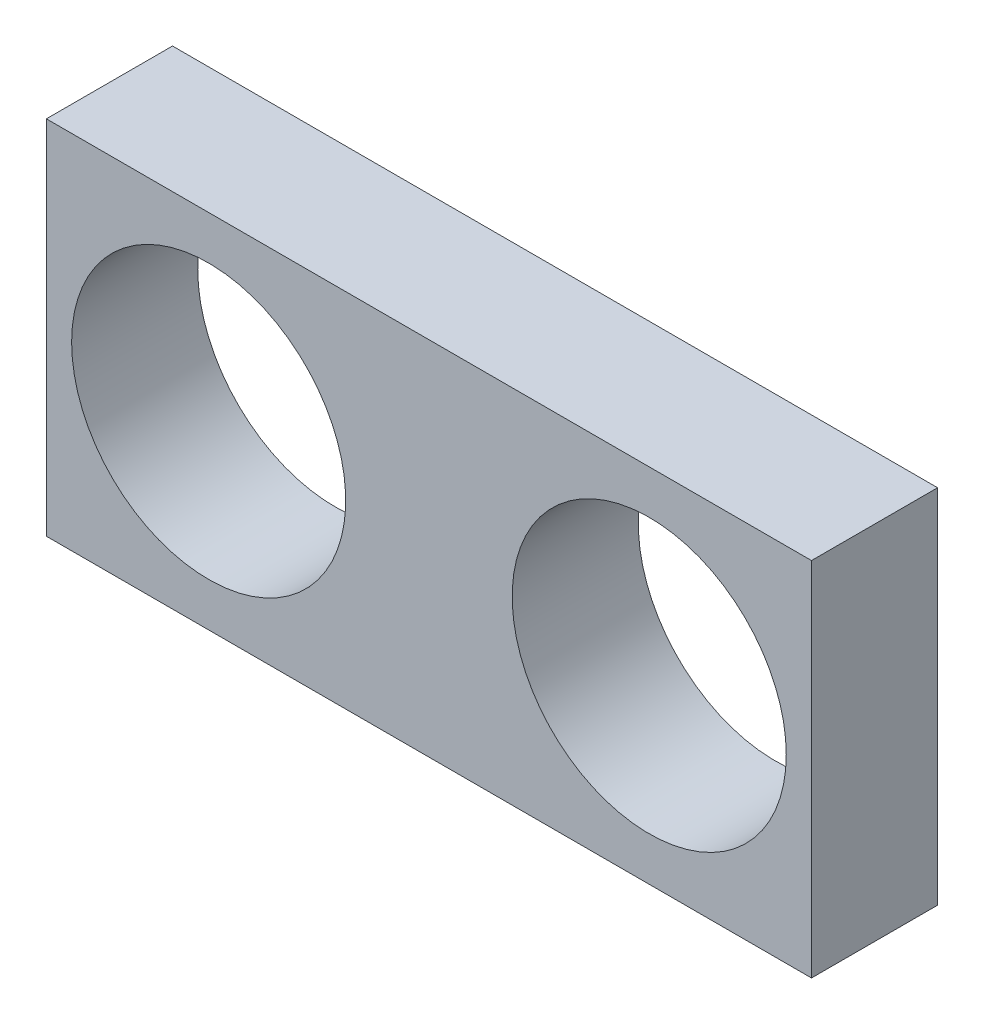
ISO-10303-21;
HEADER;
FILE_DESCRIPTION(('STEP AP214'),'2;1');
FILE_NAME('part.step','',(''),(''),'','','');
FILE_SCHEMA(('AUTOMOTIVE_DESIGN { 1 0 10303 214 1 1 1 1 }'));
ENDSEC;
DATA;
#1=APPLICATION_CONTEXT('core data for automotive mechanical design processes');
#2=APPLICATION_PROTOCOL_DEFINITION('international standard','automotive_design',2000,#1);
#3=PRODUCT_CONTEXT('',#1,'mechanical');
#4=PRODUCT('Part','Part','',(#3));
#5=PRODUCT_RELATED_PRODUCT_CATEGORY('part','',(#4));
#6=PRODUCT_DEFINITION_FORMATION('','',#4);
#7=PRODUCT_DEFINITION_CONTEXT('part definition',#1,'design');
#8=PRODUCT_DEFINITION('design','',#6,#7);
#9=PRODUCT_DEFINITION_SHAPE('','',#8);
#10=(LENGTH_UNIT() NAMED_UNIT(*) SI_UNIT(.MILLI.,.METRE.));
#11=(NAMED_UNIT(*) PLANE_ANGLE_UNIT() SI_UNIT($,.RADIAN.));
#12=(NAMED_UNIT(*) SI_UNIT($,.STERADIAN.) SOLID_ANGLE_UNIT());
#13=UNCERTAINTY_MEASURE_WITH_UNIT(LENGTH_MEASURE(1.E-05),#10,'distance_accuracy_value','');
#14=(GEOMETRIC_REPRESENTATION_CONTEXT(3) GLOBAL_UNCERTAINTY_ASSIGNED_CONTEXT((#13)) GLOBAL_UNIT_ASSIGNED_CONTEXT((#10,
#11,#12)) REPRESENTATION_CONTEXT('',''));
#15=CARTESIAN_POINT('',(0.,0.,0.));
#16=DIRECTION('',(0.,0.,1.));
#17=DIRECTION('',(1.,0.,0.));
#18=AXIS2_PLACEMENT_3D('',#15,#16,#17);
#19=CARTESIAN_POINT('',(0.,0.,7.5));
#20=DIRECTION('',(0.,0.,1.));
#21=DIRECTION('',(1.,0.,0.));
#22=AXIS2_PLACEMENT_3D('',#19,#20,#21);
#23=PLANE('',#22);
#24=CARTESIAN_POINT('',(12.6218914185639,9.88835376532399,7.5));
#25=DIRECTION('',(0.,0.,1.));
#26=DIRECTION('',(1.,0.,0.));
#27=AXIS2_PLACEMENT_3D('',#24,#25,#26);
#28=CIRCLE('',#27,8.15);
#29=CARTESIAN_POINT('',(20.7718914185639,9.88835376532399,7.5));
#30=VERTEX_POINT('',#29);
#31=EDGE_CURVE('E117',#30,#30,#28,.T.);
#32=ORIENTED_EDGE('',*,*,#31,.F.);
#33=EDGE_LOOP('',(#32));
#34=FACE_BOUND('',#33,.T.);
#35=DIRECTION('',(0.,-1.,0.));
#36=VECTOR('',#35,1.);
#37=CARTESIAN_POINT('',(-23.2281085814361,20.638353765324,7.5));
#38=LINE('',#37,#36);
#39=CARTESIAN_POINT('',(-23.2281085814361,20.638353765324,7.5));
#40=VERTEX_POINT('',#39);
#41=CARTESIAN_POINT('',(-23.2281085814361,-0.861646234676008,7.5));
#42=VERTEX_POINT('',#41);
#43=EDGE_CURVE('E97',#40,#42,#38,.T.);
#44=ORIENTED_EDGE('',*,*,#43,.T.);
#45=DIRECTION('',(1.,0.,0.));
#46=VECTOR('',#45,1.);
#47=CARTESIAN_POINT('',(-23.2281085814361,-0.861646234676008,7.5));
#48=LINE('',#47,#46);
#49=CARTESIAN_POINT('',(22.2718914185639,-0.861646234676008,7.5));
#50=VERTEX_POINT('',#49);
#51=EDGE_CURVE('E92',#42,#50,#48,.T.);
#52=ORIENTED_EDGE('',*,*,#51,.T.);
#53=DIRECTION('',(0.,1.,0.));
#54=VECTOR('',#53,1.);
#55=CARTESIAN_POINT('',(22.2718914185639,20.638353765324,7.5));
#56=LINE('',#55,#54);
#57=CARTESIAN_POINT('',(22.2718914185639,20.638353765324,7.5));
#58=VERTEX_POINT('',#57);
#59=EDGE_CURVE('E95',#50,#58,#56,.T.);
#60=ORIENTED_EDGE('',*,*,#59,.T.);
#61=DIRECTION('',(-1.,0.,0.));
#62=VECTOR('',#61,1.);
#63=CARTESIAN_POINT('',(-23.2281085814361,20.638353765324,7.5));
#64=LINE('',#63,#62);
#65=EDGE_CURVE('E62',#58,#40,#64,.T.);
#66=ORIENTED_EDGE('',*,*,#65,.T.);
#67=EDGE_LOOP('',(#44,#52,#60,#66));
#68=FACE_BOUND('',#67,.T.);
#69=CARTESIAN_POINT('',(-13.5781085814361,9.88835376532399,7.5));
#70=DIRECTION('',(0.,0.,1.));
#71=DIRECTION('',(-1.,0.,0.));
#72=AXIS2_PLACEMENT_3D('',#69,#70,#71);
#73=CIRCLE('',#72,8.15);
#74=CARTESIAN_POINT('',(-21.7281085814361,9.88835376532399,7.5));
#75=VERTEX_POINT('',#74);
#76=EDGE_CURVE('E139',#75,#75,#73,.T.);
#77=ORIENTED_EDGE('',*,*,#76,.F.);
#78=EDGE_LOOP('',(#77));
#79=FACE_BOUND('',#78,.T.);
#80=ADVANCED_FACE('F44',(#34,#68,#79),#23,.T.);
#81=CARTESIAN_POINT('',(0.,0.,0.));
#82=DIRECTION('',(0.,0.,1.));
#83=DIRECTION('',(1.,0.,0.));
#84=AXIS2_PLACEMENT_3D('',#81,#82,#83);
#85=PLANE('',#84);
#86=DIRECTION('',(0.,-1.,0.));
#87=VECTOR('',#86,1.);
#88=CARTESIAN_POINT('',(-23.2281085814361,20.638353765324,0.));
#89=LINE('',#88,#87);
#90=CARTESIAN_POINT('',(-23.2281085814361,20.638353765324,0.));
#91=VERTEX_POINT('',#90);
#92=CARTESIAN_POINT('',(-23.2281085814361,-0.861646234676008,0.));
#93=VERTEX_POINT('',#92);
#94=EDGE_CURVE('E113',#91,#93,#89,.T.);
#95=ORIENTED_EDGE('',*,*,#94,.F.);
#96=DIRECTION('',(-1.,0.,0.));
#97=VECTOR('',#96,1.);
#98=CARTESIAN_POINT('',(-23.2281085814361,20.638353765324,0.));
#99=LINE('',#98,#97);
#100=CARTESIAN_POINT('',(22.2718914185639,20.638353765324,0.));
#101=VERTEX_POINT('',#100);
#102=EDGE_CURVE('E85',#101,#91,#99,.T.);
#103=ORIENTED_EDGE('',*,*,#102,.F.);
#104=DIRECTION('',(0.,1.,0.));
#105=VECTOR('',#104,1.);
#106=CARTESIAN_POINT('',(22.2718914185639,20.638353765324,0.));
#107=LINE('',#106,#105);
#108=CARTESIAN_POINT('',(22.2718914185639,-0.861646234676008,0.));
#109=VERTEX_POINT('',#108);
#110=EDGE_CURVE('E79',#109,#101,#107,.T.);
#111=ORIENTED_EDGE('',*,*,#110,.F.);
#112=DIRECTION('',(1.,0.,0.));
#113=VECTOR('',#112,1.);
#114=CARTESIAN_POINT('',(-23.2281085814361,-0.861646234676008,0.));
#115=LINE('',#114,#113);
#116=EDGE_CURVE('E102',#93,#109,#115,.T.);
#117=ORIENTED_EDGE('',*,*,#116,.F.);
#118=EDGE_LOOP('',(#95,#103,#111,#117));
#119=FACE_BOUND('',#118,.T.);
#120=CARTESIAN_POINT('',(12.6218914185639,9.88835376532399,0.));
#121=DIRECTION('',(0.,0.,1.));
#122=DIRECTION('',(1.,0.,0.));
#123=AXIS2_PLACEMENT_3D('',#120,#121,#122);
#124=CIRCLE('',#123,8.15);
#125=CARTESIAN_POINT('',(20.7718914185639,9.88835376532399,0.));
#126=VERTEX_POINT('',#125);
#127=EDGE_CURVE('E135',#126,#126,#124,.T.);
#128=ORIENTED_EDGE('',*,*,#127,.T.);
#129=EDGE_LOOP('',(#128));
#130=FACE_BOUND('',#129,.T.);
#131=CARTESIAN_POINT('',(-13.5781085814361,9.88835376532399,0.));
#132=DIRECTION('',(0.,0.,1.));
#133=DIRECTION('',(-1.,0.,0.));
#134=AXIS2_PLACEMENT_3D('',#131,#132,#133);
#135=CIRCLE('',#134,8.15);
#136=CARTESIAN_POINT('',(-21.7281085814361,9.88835376532399,0.));
#137=VERTEX_POINT('',#136);
#138=EDGE_CURVE('E143',#137,#137,#135,.T.);
#139=ORIENTED_EDGE('',*,*,#138,.T.);
#140=EDGE_LOOP('',(#139));
#141=FACE_BOUND('',#140,.T.);
#142=ADVANCED_FACE('F130',(#119,#130,#141),#85,.F.);
#143=CARTESIAN_POINT('',(-23.2281085814361,20.638353765324,7.5));
#144=DIRECTION('',(1.,0.,0.));
#145=DIRECTION('',(0.,1.,0.));
#146=AXIS2_PLACEMENT_3D('',#143,#144,#145);
#147=PLANE('',#146);
#148=ORIENTED_EDGE('',*,*,#94,.T.);
#149=DIRECTION('',(0.,0.,-1.));
#150=VECTOR('',#149,1.);
#151=CARTESIAN_POINT('',(-23.2281085814361,-0.861646234676008,7.5));
#152=LINE('',#151,#150);
#153=EDGE_CURVE('E11',#42,#93,#152,.T.);
#154=ORIENTED_EDGE('',*,*,#153,.F.);
#155=ORIENTED_EDGE('',*,*,#43,.F.);
#156=DIRECTION('',(0.,0.,-1.));
#157=VECTOR('',#156,1.);
#158=CARTESIAN_POINT('',(-23.2281085814361,20.638353765324,7.5));
#159=LINE('',#158,#157);
#160=EDGE_CURVE('E109',#40,#91,#159,.T.);
#161=ORIENTED_EDGE('',*,*,#160,.T.);
#162=EDGE_LOOP('',(#148,#154,#155,#161));
#163=FACE_BOUND('',#162,.T.);
#164=ADVANCED_FACE('F46',(#163),#147,.F.);
#165=CARTESIAN_POINT('',(-23.2281085814361,-0.861646234676008,7.5));
#166=DIRECTION('',(0.,1.,0.));
#167=DIRECTION('',(0.,0.,1.));
#168=AXIS2_PLACEMENT_3D('',#165,#166,#167);
#169=PLANE('',#168);
#170=ORIENTED_EDGE('',*,*,#116,.T.);
#171=DIRECTION('',(0.,0.,-1.));
#172=VECTOR('',#171,1.);
#173=CARTESIAN_POINT('',(22.2718914185639,-0.861646234676008,7.5));
#174=LINE('',#173,#172);
#175=EDGE_CURVE('E54',#50,#109,#174,.T.);
#176=ORIENTED_EDGE('',*,*,#175,.F.);
#177=ORIENTED_EDGE('',*,*,#51,.F.);
#178=ORIENTED_EDGE('',*,*,#153,.T.);
#179=EDGE_LOOP('',(#170,#176,#177,#178));
#180=FACE_BOUND('',#179,.T.);
#181=ADVANCED_FACE('F101',(#180),#169,.F.);
#182=CARTESIAN_POINT('',(22.2718914185639,20.638353765324,7.5));
#183=DIRECTION('',(-1.,0.,0.));
#184=DIRECTION('',(0.,0.,1.));
#185=AXIS2_PLACEMENT_3D('',#182,#183,#184);
#186=PLANE('',#185);
#187=ORIENTED_EDGE('',*,*,#110,.T.);
#188=DIRECTION('',(0.,0.,-1.));
#189=VECTOR('',#188,1.);
#190=CARTESIAN_POINT('',(22.2718914185639,20.638353765324,7.5));
#191=LINE('',#190,#189);
#192=EDGE_CURVE('E104',#58,#101,#191,.T.);
#193=ORIENTED_EDGE('',*,*,#192,.F.);
#194=ORIENTED_EDGE('',*,*,#59,.F.);
#195=ORIENTED_EDGE('',*,*,#175,.T.);
#196=EDGE_LOOP('',(#187,#193,#194,#195));
#197=FACE_BOUND('',#196,.T.);
#198=ADVANCED_FACE('F105',(#197),#186,.F.);
#199=CARTESIAN_POINT('',(-23.2281085814361,20.638353765324,7.5));
#200=DIRECTION('',(0.,-1.,0.));
#201=DIRECTION('',(0.,0.,-1.));
#202=AXIS2_PLACEMENT_3D('',#199,#200,#201);
#203=PLANE('',#202);
#204=ORIENTED_EDGE('',*,*,#102,.T.);
#205=ORIENTED_EDGE('',*,*,#160,.F.);
#206=ORIENTED_EDGE('',*,*,#65,.F.);
#207=ORIENTED_EDGE('',*,*,#192,.T.);
#208=EDGE_LOOP('',(#204,#205,#206,#207));
#209=FACE_BOUND('',#208,.T.);
#210=ADVANCED_FACE('F127',(#209),#203,.F.);
#211=CARTESIAN_POINT('',(12.6218914185639,9.88835376532399,7.5));
#212=DIRECTION('',(0.,0.,-1.));
#213=DIRECTION('',(-1.,0.,0.));
#214=AXIS2_PLACEMENT_3D('',#211,#212,#213);
#215=CYLINDRICAL_SURFACE('',#214,8.15);
#216=ORIENTED_EDGE('',*,*,#31,.T.);
#217=EDGE_LOOP('',(#216));
#218=FACE_BOUND('',#217,.T.);
#219=ORIENTED_EDGE('',*,*,#127,.F.);
#220=EDGE_LOOP('',(#219));
#221=FACE_BOUND('',#220,.T.);
#222=ADVANCED_FACE('F162',(#218,#221),#215,.F.);
#223=CARTESIAN_POINT('',(-13.5781085814361,9.88835376532399,7.5));
#224=DIRECTION('',(0.,0.,-1.));
#225=DIRECTION('',(-1.,0.,0.));
#226=AXIS2_PLACEMENT_3D('',#223,#224,#225);
#227=CYLINDRICAL_SURFACE('',#226,8.15);
#228=ORIENTED_EDGE('',*,*,#76,.T.);
#229=EDGE_LOOP('',(#228));
#230=FACE_BOUND('',#229,.T.);
#231=ORIENTED_EDGE('',*,*,#138,.F.);
#232=EDGE_LOOP('',(#231));
#233=FACE_BOUND('',#232,.T.);
#234=ADVANCED_FACE('F151',(#230,#233),#227,.F.);
#235=CLOSED_SHELL('',(#80,#142,#164,#181,#198,#210,#222,#234));
#236=MANIFOLD_SOLID_BREP('B2',#235);
#237=ADVANCED_BREP_SHAPE_REPRESENTATION('',(#18,#236),#14);
#238=SHAPE_DEFINITION_REPRESENTATION(#9,#237);
ENDSEC;
END-ISO-10303-21;
